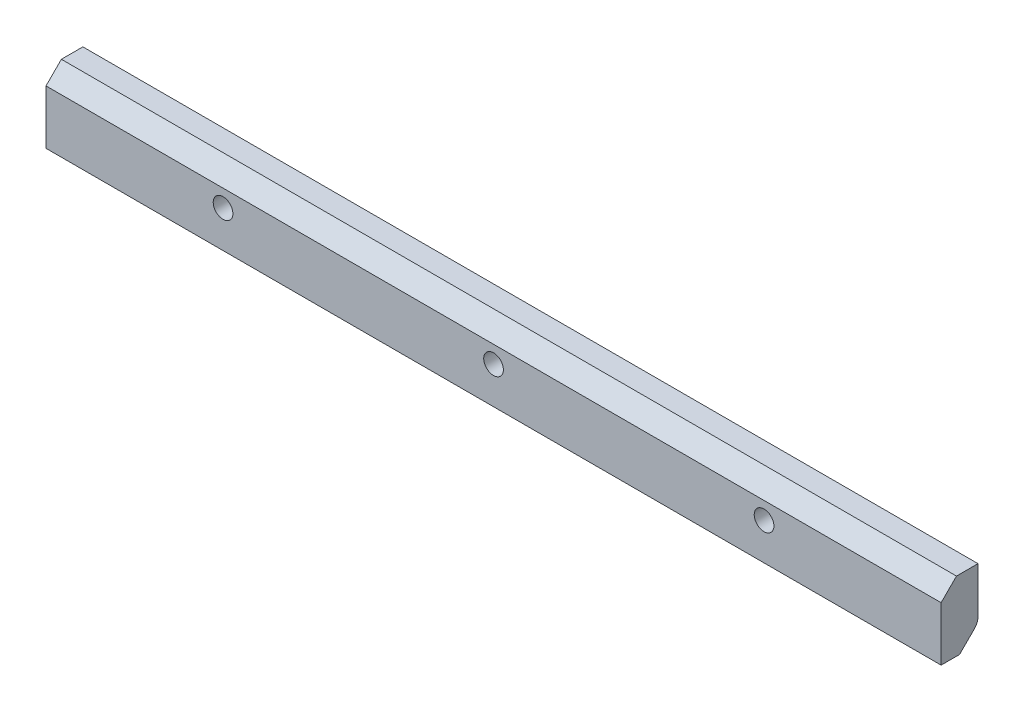
ISO-10303-21;
HEADER;
FILE_DESCRIPTION(('STEP AP214'),'2;1');
FILE_NAME('part.step','',(''),(''),'','','');
FILE_SCHEMA(('AUTOMOTIVE_DESIGN { 1 0 10303 214 1 1 1 1 }'));
ENDSEC;
DATA;
#1=APPLICATION_CONTEXT('core data for automotive mechanical design processes');
#2=APPLICATION_PROTOCOL_DEFINITION('international standard','automotive_design',2000,#1);
#3=PRODUCT_CONTEXT('',#1,'mechanical');
#4=PRODUCT('Part','Part','',(#3));
#5=PRODUCT_RELATED_PRODUCT_CATEGORY('part','',(#4));
#6=PRODUCT_DEFINITION_FORMATION('','',#4);
#7=PRODUCT_DEFINITION_CONTEXT('part definition',#1,'design');
#8=PRODUCT_DEFINITION('design','',#6,#7);
#9=PRODUCT_DEFINITION_SHAPE('','',#8);
#10=(LENGTH_UNIT() NAMED_UNIT(*) SI_UNIT(.MILLI.,.METRE.));
#11=(NAMED_UNIT(*) PLANE_ANGLE_UNIT() SI_UNIT($,.RADIAN.));
#12=(NAMED_UNIT(*) SI_UNIT($,.STERADIAN.) SOLID_ANGLE_UNIT());
#13=UNCERTAINTY_MEASURE_WITH_UNIT(LENGTH_MEASURE(1.E-05),#10,'distance_accuracy_value','');
#14=(GEOMETRIC_REPRESENTATION_CONTEXT(3) GLOBAL_UNCERTAINTY_ASSIGNED_CONTEXT((#13)) GLOBAL_UNIT_ASSIGNED_CONTEXT((#10,
#11,#12)) REPRESENTATION_CONTEXT('',''));
#15=CARTESIAN_POINT('',(0.,0.,0.));
#16=DIRECTION('',(0.,0.,1.));
#17=DIRECTION('',(1.,0.,0.));
#18=AXIS2_PLACEMENT_3D('',#15,#16,#17);
#19=CARTESIAN_POINT('',(36.4,-3.2,0.));
#20=DIRECTION('',(0.,1.,0.));
#21=DIRECTION('',(0.,0.,1.));
#22=AXIS2_PLACEMENT_3D('',#19,#20,#21);
#23=PLANE('',#22);
#24=DIRECTION('',(0.,0.,-1.));
#25=VECTOR('',#24,1.);
#26=CARTESIAN_POINT('',(-36.4,-3.2,0.));
#27=LINE('',#26,#25);
#28=CARTESIAN_POINT('',(-36.4,-3.2,2.));
#29=VERTEX_POINT('',#28);
#30=CARTESIAN_POINT('',(-36.4,-3.2,0.500000000000012));
#31=VERTEX_POINT('',#30);
#32=EDGE_CURVE('E119',#29,#31,#27,.T.);
#33=ORIENTED_EDGE('',*,*,#32,.T.);
#34=DIRECTION('',(-1.,0.,0.));
#35=VECTOR('',#34,1.);
#36=CARTESIAN_POINT('',(37.1071067811865,-3.2,0.500000000000012));
#37=LINE('',#36,#35);
#38=CARTESIAN_POINT('',(36.4,-3.2,0.500000000000012));
#39=VERTEX_POINT('',#38);
#40=EDGE_CURVE('E167',#39,#31,#37,.T.);
#41=ORIENTED_EDGE('',*,*,#40,.F.);
#42=DIRECTION('',(0.,0.,-1.));
#43=VECTOR('',#42,1.);
#44=CARTESIAN_POINT('',(36.4,-3.2,0.));
#45=LINE('',#44,#43);
#46=CARTESIAN_POINT('',(36.4,-3.2,2.));
#47=VERTEX_POINT('',#46);
#48=EDGE_CURVE('E174',#47,#39,#45,.T.);
#49=ORIENTED_EDGE('',*,*,#48,.F.);
#50=DIRECTION('',(-1.,0.,0.));
#51=VECTOR('',#50,1.);
#52=CARTESIAN_POINT('',(36.4,-3.2,2.));
#53=LINE('',#52,#51);
#54=EDGE_CURVE('E182',#47,#29,#53,.T.);
#55=ORIENTED_EDGE('',*,*,#54,.T.);
#56=EDGE_LOOP('',(#33,#41,#49,#55));
#57=FACE_BOUND('',#56,.T.);
#58=ADVANCED_FACE('F41',(#57),#23,.F.);
#59=CARTESIAN_POINT('',(36.4,-3.2,2.));
#60=DIRECTION('',(0.,0.,-1.));
#61=DIRECTION('',(-1.,0.,0.));
#62=AXIS2_PLACEMENT_3D('',#59,#60,#61);
#63=PLANE('',#62);
#64=CARTESIAN_POINT('',(-21.9999999999997,-0.199999999999756,2.));
#65=DIRECTION('',(0.,0.,1.));
#66=DIRECTION('',(1.,0.,0.));
#67=AXIS2_PLACEMENT_3D('',#64,#65,#66);
#68=CIRCLE('',#67,0.799999999999988);
#69=CARTESIAN_POINT('',(-21.1999999999997,-0.199999999999756,2.));
#70=VERTEX_POINT('',#69);
#71=EDGE_CURVE('E139',#70,#70,#68,.T.);
#72=ORIENTED_EDGE('',*,*,#71,.F.);
#73=EDGE_LOOP('',(#72));
#74=FACE_BOUND('',#73,.T.);
#75=CARTESIAN_POINT('',(22.0000000000003,-0.199999999999756,2.));
#76=DIRECTION('',(0.,0.,1.));
#77=DIRECTION('',(1.,0.,0.));
#78=AXIS2_PLACEMENT_3D('',#75,#76,#77);
#79=CIRCLE('',#78,0.799999999999992);
#80=CARTESIAN_POINT('',(22.8000000000003,-0.199999999999756,2.));
#81=VERTEX_POINT('',#80);
#82=EDGE_CURVE('E147',#81,#81,#79,.T.);
#83=ORIENTED_EDGE('',*,*,#82,.F.);
#84=EDGE_LOOP('',(#83));
#85=FACE_BOUND('',#84,.T.);
#86=CARTESIAN_POINT('',(0.,-0.199999999999756,2.));
#87=DIRECTION('',(0.,0.,1.));
#88=DIRECTION('',(1.,0.,0.));
#89=AXIS2_PLACEMENT_3D('',#86,#87,#88);
#90=CIRCLE('',#89,0.79999999999999);
#91=CARTESIAN_POINT('',(0.79999999999999,-0.199999999999756,2.));
#92=VERTEX_POINT('',#91);
#93=EDGE_CURVE('E155',#92,#92,#90,.T.);
#94=ORIENTED_EDGE('',*,*,#93,.F.);
#95=EDGE_LOOP('',(#94));
#96=FACE_BOUND('',#95,.T.);
#97=DIRECTION('',(0.,-1.,0.));
#98=VECTOR('',#97,1.);
#99=CARTESIAN_POINT('',(36.4,-3.2,2.));
#100=LINE('',#99,#98);
#101=CARTESIAN_POINT('',(36.4,1.2,2.));
#102=VERTEX_POINT('',#101);
#103=EDGE_CURVE('E178',#102,#47,#100,.T.);
#104=ORIENTED_EDGE('',*,*,#103,.F.);
#105=DIRECTION('',(1.,0.,0.));
#106=VECTOR('',#105,1.);
#107=CARTESIAN_POINT('',(-36.4,1.2,2.));
#108=LINE('',#107,#106);
#109=CARTESIAN_POINT('',(-36.4,1.2,2.));
#110=VERTEX_POINT('',#109);
#111=EDGE_CURVE('E136',#110,#102,#108,.T.);
#112=ORIENTED_EDGE('',*,*,#111,.F.);
#113=DIRECTION('',(0.,-1.,0.));
#114=VECTOR('',#113,1.);
#115=CARTESIAN_POINT('',(-36.4,-3.2,2.));
#116=LINE('',#115,#114);
#117=EDGE_CURVE('E179',#110,#29,#116,.T.);
#118=ORIENTED_EDGE('',*,*,#117,.T.);
#119=ORIENTED_EDGE('',*,*,#54,.F.);
#120=EDGE_LOOP('',(#104,#112,#118,#119));
#121=FACE_BOUND('',#120,.T.);
#122=ADVANCED_FACE('F212',(#74,#85,#96,#121),#63,.F.);
#123=CARTESIAN_POINT('',(36.4,0.,0.));
#124=DIRECTION('',(-1.,0.,0.));
#125=DIRECTION('',(0.,0.,1.));
#126=AXIS2_PLACEMENT_3D('',#123,#124,#125);
#127=PLANE('',#126);
#128=DIRECTION('',(0.,-0.707106781186539,0.707106781186556));
#129=VECTOR('',#128,1.);
#130=CARTESIAN_POINT('',(36.4,-2.7,0.));
#131=LINE('',#130,#129);
#132=CARTESIAN_POINT('',(36.4,-1.99289321881348,-0.70710678118654));
#133=VERTEX_POINT('',#132);
#134=EDGE_CURVE('E164',#133,#39,#131,.T.);
#135=ORIENTED_EDGE('',*,*,#134,.F.);
#136=CARTESIAN_POINT('',(36.4,-1.28578643762692,0.));
#137=DIRECTION('',(-1.,0.,0.));
#138=DIRECTION('',(0.,0.,1.));
#139=AXIS2_PLACEMENT_3D('',#136,#137,#138);
#140=CIRCLE('',#139,1.);
#141=CARTESIAN_POINT('',(36.4,-1.28578643762692,-1.));
#142=VERTEX_POINT('',#141);
#143=EDGE_CURVE('E11',#133,#142,#140,.F.);
#144=ORIENTED_EDGE('',*,*,#143,.T.);
#145=DIRECTION('',(0.,-1.,0.));
#146=VECTOR('',#145,1.);
#147=CARTESIAN_POINT('',(36.4,2.45,-1.));
#148=LINE('',#147,#146);
#149=CARTESIAN_POINT('',(36.4,2.45,-1.));
#150=VERTEX_POINT('',#149);
#151=EDGE_CURVE('E126',#150,#142,#148,.T.);
#152=ORIENTED_EDGE('',*,*,#151,.F.);
#153=DIRECTION('',(0.,0.,-1.));
#154=VECTOR('',#153,1.);
#155=CARTESIAN_POINT('',(36.4,2.45,2.));
#156=LINE('',#155,#154);
#157=CARTESIAN_POINT('',(36.4,2.45,0.75));
#158=VERTEX_POINT('',#157);
#159=EDGE_CURVE('E120',#158,#150,#156,.T.);
#160=ORIENTED_EDGE('',*,*,#159,.F.);
#161=DIRECTION('',(0.,0.707106781186548,-0.707106781186547));
#162=VECTOR('',#161,1.);
#163=CARTESIAN_POINT('',(36.4,1.2,2.));
#164=LINE('',#163,#162);
#165=EDGE_CURVE('E129',#102,#158,#164,.T.);
#166=ORIENTED_EDGE('',*,*,#165,.F.);
#167=ORIENTED_EDGE('',*,*,#103,.T.);
#168=ORIENTED_EDGE('',*,*,#48,.T.);
#169=EDGE_LOOP('',(#135,#144,#152,#160,#166,#167,#168));
#170=FACE_BOUND('',#169,.T.);
#171=ADVANCED_FACE('F201',(#170),#127,.F.);
#172=CARTESIAN_POINT('',(-36.4,0.,0.));
#173=DIRECTION('',(-1.,0.,0.));
#174=DIRECTION('',(0.,0.,1.));
#175=AXIS2_PLACEMENT_3D('',#172,#173,#174);
#176=PLANE('',#175);
#177=DIRECTION('',(0.,1.,0.));
#178=VECTOR('',#177,1.);
#179=CARTESIAN_POINT('',(-36.4,2.45,-1.));
#180=LINE('',#179,#178);
#181=CARTESIAN_POINT('',(-36.4,-1.28578643762692,-1.));
#182=VERTEX_POINT('',#181);
#183=CARTESIAN_POINT('',(-36.4,2.45,-1.));
#184=VERTEX_POINT('',#183);
#185=EDGE_CURVE('E100',#182,#184,#180,.T.);
#186=ORIENTED_EDGE('',*,*,#185,.F.);
#187=CARTESIAN_POINT('',(-36.4,-1.28578643762692,0.));
#188=DIRECTION('',(-1.,0.,0.));
#189=DIRECTION('',(0.,0.,1.));
#190=AXIS2_PLACEMENT_3D('',#187,#188,#189);
#191=CIRCLE('',#190,1.);
#192=CARTESIAN_POINT('',(-36.4,-1.99289321881348,-0.70710678118654));
#193=VERTEX_POINT('',#192);
#194=EDGE_CURVE('E64',#182,#193,#191,.T.);
#195=ORIENTED_EDGE('',*,*,#194,.T.);
#196=DIRECTION('',(0.,0.707106781186539,-0.707106781186556));
#197=VECTOR('',#196,1.);
#198=CARTESIAN_POINT('',(-36.4,-2.7,0.));
#199=LINE('',#198,#197);
#200=EDGE_CURVE('E163',#31,#193,#199,.T.);
#201=ORIENTED_EDGE('',*,*,#200,.F.);
#202=ORIENTED_EDGE('',*,*,#32,.F.);
#203=ORIENTED_EDGE('',*,*,#117,.F.);
#204=DIRECTION('',(0.,0.707106781186548,-0.707106781186547));
#205=VECTOR('',#204,1.);
#206=CARTESIAN_POINT('',(-36.4,1.2,2.));
#207=LINE('',#206,#205);
#208=CARTESIAN_POINT('',(-36.4,2.45,0.75));
#209=VERTEX_POINT('',#208);
#210=EDGE_CURVE('E115',#110,#209,#207,.T.);
#211=ORIENTED_EDGE('',*,*,#210,.T.);
#212=DIRECTION('',(0.,0.,-1.));
#213=VECTOR('',#212,1.);
#214=CARTESIAN_POINT('',(-36.4,2.45,2.));
#215=LINE('',#214,#213);
#216=EDGE_CURVE('E112',#209,#184,#215,.T.);
#217=ORIENTED_EDGE('',*,*,#216,.T.);
#218=EDGE_LOOP('',(#186,#195,#201,#202,#203,#211,#217));
#219=FACE_BOUND('',#218,.T.);
#220=ADVANCED_FACE('F113',(#219),#176,.T.);
#221=CARTESIAN_POINT('',(-36.4,2.45,2.));
#222=DIRECTION('',(0.,-1.,0.));
#223=DIRECTION('',(0.,0.,-1.));
#224=AXIS2_PLACEMENT_3D('',#221,#222,#223);
#225=PLANE('',#224);
#226=ORIENTED_EDGE('',*,*,#216,.F.);
#227=DIRECTION('',(1.,0.,0.));
#228=VECTOR('',#227,1.);
#229=CARTESIAN_POINT('',(-36.4,2.45,0.75));
#230=LINE('',#229,#228);
#231=EDGE_CURVE('E191',#209,#158,#230,.T.);
#232=ORIENTED_EDGE('',*,*,#231,.T.);
#233=ORIENTED_EDGE('',*,*,#159,.T.);
#234=DIRECTION('',(-1.,0.,0.));
#235=VECTOR('',#234,1.);
#236=CARTESIAN_POINT('',(41.6461890930465,2.45,-1.));
#237=LINE('',#236,#235);
#238=EDGE_CURVE('E105',#150,#184,#237,.T.);
#239=ORIENTED_EDGE('',*,*,#238,.T.);
#240=EDGE_LOOP('',(#226,#232,#233,#239));
#241=FACE_BOUND('',#240,.T.);
#242=ADVANCED_FACE('F122',(#241),#225,.F.);
#243=CARTESIAN_POINT('',(37.1071067811865,-2.7,0.));
#244=DIRECTION('',(0.,0.707106781186556,0.707106781186539));
#245=DIRECTION('',(0.,-0.707106781186539,0.707106781186556));
#246=AXIS2_PLACEMENT_3D('',#243,#244,#245);
#247=PLANE('',#246);
#248=ORIENTED_EDGE('',*,*,#200,.T.);
#249=DIRECTION('',(-1.,0.,0.));
#250=VECTOR('',#249,1.);
#251=CARTESIAN_POINT('',(37.1071067811865,-1.99289321881348,-0.707106781186539));
#252=LINE('',#251,#250);
#253=EDGE_CURVE('E50',#193,#133,#252,.F.);
#254=ORIENTED_EDGE('',*,*,#253,.T.);
#255=ORIENTED_EDGE('',*,*,#134,.T.);
#256=ORIENTED_EDGE('',*,*,#40,.T.);
#257=EDGE_LOOP('',(#248,#254,#255,#256));
#258=FACE_BOUND('',#257,.T.);
#259=ADVANCED_FACE('F226',(#258),#247,.F.);
#260=CARTESIAN_POINT('',(0.,-0.199999999999756,2.));
#261=DIRECTION('',(0.,0.,1.));
#262=DIRECTION('',(1.,0.,0.));
#263=AXIS2_PLACEMENT_3D('',#260,#261,#262);
#264=CYLINDRICAL_SURFACE('',#263,0.799999999999989);
#265=ORIENTED_EDGE('',*,*,#93,.T.);
#266=EDGE_LOOP('',(#265));
#267=FACE_BOUND('',#266,.T.);
#268=CARTESIAN_POINT('',(0.,-0.199999999999756,0.));
#269=DIRECTION('',(0.,0.,1.));
#270=DIRECTION('',(1.,0.,0.));
#271=AXIS2_PLACEMENT_3D('',#268,#269,#270);
#272=CIRCLE('',#271,0.799999999999989);
#273=CARTESIAN_POINT('',(0.799999999999989,-0.199999999999756,0.));
#274=VERTEX_POINT('',#273);
#275=EDGE_CURVE('E159',#274,#274,#272,.T.);
#276=ORIENTED_EDGE('',*,*,#275,.F.);
#277=EDGE_LOOP('',(#276));
#278=FACE_BOUND('',#277,.T.);
#279=ADVANCED_FACE('F229',(#267,#278),#264,.F.);
#280=CARTESIAN_POINT('',(22.0000000000003,-0.199999999999756,2.));
#281=DIRECTION('',(0.,0.,1.));
#282=DIRECTION('',(1.,0.,0.));
#283=AXIS2_PLACEMENT_3D('',#280,#281,#282);
#284=CYLINDRICAL_SURFACE('',#283,0.79999999999999);
#285=ORIENTED_EDGE('',*,*,#82,.T.);
#286=EDGE_LOOP('',(#285));
#287=FACE_BOUND('',#286,.T.);
#288=CARTESIAN_POINT('',(22.0000000000003,-0.199999999999756,0.));
#289=DIRECTION('',(0.,0.,1.));
#290=DIRECTION('',(1.,0.,0.));
#291=AXIS2_PLACEMENT_3D('',#288,#289,#290);
#292=CIRCLE('',#291,0.79999999999999);
#293=CARTESIAN_POINT('',(22.8000000000003,-0.199999999999756,0.));
#294=VERTEX_POINT('',#293);
#295=EDGE_CURVE('E151',#294,#294,#292,.T.);
#296=ORIENTED_EDGE('',*,*,#295,.F.);
#297=EDGE_LOOP('',(#296));
#298=FACE_BOUND('',#297,.T.);
#299=ADVANCED_FACE('F232',(#287,#298),#284,.F.);
#300=CARTESIAN_POINT('',(-21.9999999999997,-0.199999999999756,2.));
#301=DIRECTION('',(0.,0.,1.));
#302=DIRECTION('',(1.,0.,0.));
#303=AXIS2_PLACEMENT_3D('',#300,#301,#302);
#304=CYLINDRICAL_SURFACE('',#303,0.799999999999988);
#305=ORIENTED_EDGE('',*,*,#71,.T.);
#306=EDGE_LOOP('',(#305));
#307=FACE_BOUND('',#306,.T.);
#308=CARTESIAN_POINT('',(-21.9999999999997,-0.199999999999756,0.));
#309=DIRECTION('',(0.,0.,1.));
#310=DIRECTION('',(1.,0.,0.));
#311=AXIS2_PLACEMENT_3D('',#308,#309,#310);
#312=CIRCLE('',#311,0.799999999999988);
#313=CARTESIAN_POINT('',(-21.1999999999997,-0.199999999999756,0.));
#314=VERTEX_POINT('',#313);
#315=EDGE_CURVE('E143',#314,#314,#312,.T.);
#316=ORIENTED_EDGE('',*,*,#315,.F.);
#317=EDGE_LOOP('',(#316));
#318=FACE_BOUND('',#317,.T.);
#319=ADVANCED_FACE('F236',(#307,#318),#304,.F.);
#320=CARTESIAN_POINT('',(-36.4,1.2,2.));
#321=DIRECTION('',(0.,-0.707106781186547,-0.707106781186548));
#322=DIRECTION('',(0.,0.707106781186548,-0.707106781186547));
#323=AXIS2_PLACEMENT_3D('',#320,#321,#322);
#324=PLANE('',#323);
#325=ORIENTED_EDGE('',*,*,#210,.F.);
#326=ORIENTED_EDGE('',*,*,#111,.T.);
#327=ORIENTED_EDGE('',*,*,#165,.T.);
#328=ORIENTED_EDGE('',*,*,#231,.F.);
#329=EDGE_LOOP('',(#325,#326,#327,#328));
#330=FACE_BOUND('',#329,.T.);
#331=ADVANCED_FACE('F240',(#330),#324,.F.);
#332=CARTESIAN_POINT('',(41.6461890930465,-2.7,0.));
#333=DIRECTION('',(0.,0.,-1.));
#334=DIRECTION('',(0.,1.,0.));
#335=AXIS2_PLACEMENT_3D('',#332,#333,#334);
#336=PLANE('',#335);
#337=ORIENTED_EDGE('',*,*,#275,.T.);
#338=EDGE_LOOP('',(#337));
#339=FACE_BOUND('',#338,.T.);
#340=ADVANCED_FACE('F244',(#339),#336,.F.);
#341=ORIENTED_EDGE('',*,*,#295,.T.);
#342=EDGE_LOOP('',(#341));
#343=FACE_BOUND('',#342,.T.);
#344=ADVANCED_FACE('F246',(#343),#336,.F.);
#345=ORIENTED_EDGE('',*,*,#315,.T.);
#346=EDGE_LOOP('',(#345));
#347=FACE_BOUND('',#346,.T.);
#348=ADVANCED_FACE('F209',(#347),#336,.F.);
#349=CARTESIAN_POINT('',(41.6461890930465,2.45,-1.));
#350=DIRECTION('',(0.,0.,1.));
#351=DIRECTION('',(0.,-1.,0.));
#352=AXIS2_PLACEMENT_3D('',#349,#350,#351);
#353=PLANE('',#352);
#354=ORIENTED_EDGE('',*,*,#151,.T.);
#355=DIRECTION('',(-1.,0.,0.));
#356=VECTOR('',#355,1.);
#357=CARTESIAN_POINT('',(41.6461890930465,-1.28578643762692,-1.));
#358=LINE('',#357,#356);
#359=EDGE_CURVE('E107',#142,#182,#358,.T.);
#360=ORIENTED_EDGE('',*,*,#359,.T.);
#361=ORIENTED_EDGE('',*,*,#185,.T.);
#362=ORIENTED_EDGE('',*,*,#238,.F.);
#363=EDGE_LOOP('',(#354,#360,#361,#362));
#364=FACE_BOUND('',#363,.T.);
#365=ADVANCED_FACE('F103',(#364),#353,.F.);
#366=CARTESIAN_POINT('',(41.6461890930465,-1.28578643762692,0.));
#367=DIRECTION('',(-1.,0.,0.));
#368=DIRECTION('',(0.,0.,1.));
#369=AXIS2_PLACEMENT_3D('',#366,#367,#368);
#370=CYLINDRICAL_SURFACE('',#369,1.);
#371=ORIENTED_EDGE('',*,*,#143,.F.);
#372=ORIENTED_EDGE('',*,*,#253,.F.);
#373=ORIENTED_EDGE('',*,*,#194,.F.);
#374=ORIENTED_EDGE('',*,*,#359,.F.);
#375=EDGE_LOOP('',(#371,#372,#373,#374));
#376=FACE_BOUND('',#375,.T.);
#377=ADVANCED_FACE('F43',(#376),#370,.T.);
#378=CLOSED_SHELL('',(#58,#122,#171,#220,#242,#259,#279,#299,#319,#331,#340,#344,#348,#365,#377));
#379=MANIFOLD_SOLID_BREP('B2',#378);
#380=ADVANCED_BREP_SHAPE_REPRESENTATION('',(#18,#379),#14);
#381=SHAPE_DEFINITION_REPRESENTATION(#9,#380);
ENDSEC;
END-ISO-10303-21;
